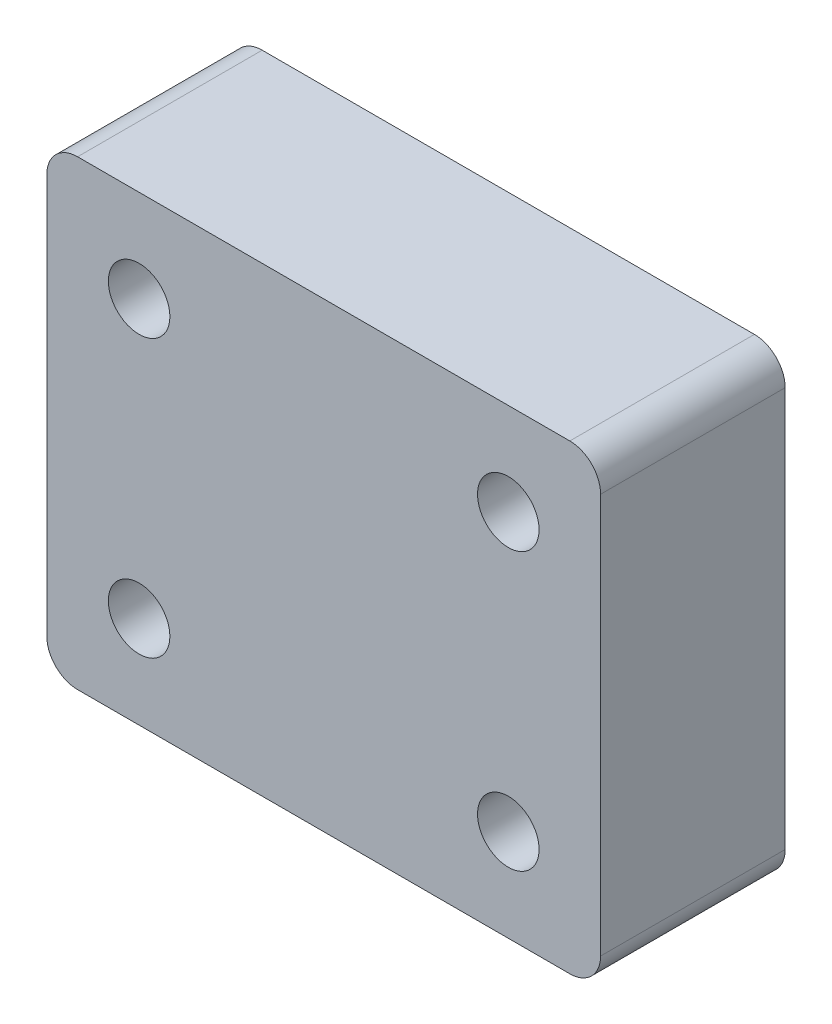
ISO-10303-21;
HEADER;
FILE_DESCRIPTION(('STEP AP214'),'2;1');
FILE_NAME('part.step','',(''),(''),'','','');
FILE_SCHEMA(('AUTOMOTIVE_DESIGN { 1 0 10303 214 1 1 1 1 }'));
ENDSEC;
DATA;
#1=APPLICATION_CONTEXT('core data for automotive mechanical design processes');
#2=APPLICATION_PROTOCOL_DEFINITION('international standard','automotive_design',2000,#1);
#3=PRODUCT_CONTEXT('',#1,'mechanical');
#4=PRODUCT('Part','Part','',(#3));
#5=PRODUCT_RELATED_PRODUCT_CATEGORY('part','',(#4));
#6=PRODUCT_DEFINITION_FORMATION('','',#4);
#7=PRODUCT_DEFINITION_CONTEXT('part definition',#1,'design');
#8=PRODUCT_DEFINITION('design','',#6,#7);
#9=PRODUCT_DEFINITION_SHAPE('','',#8);
#10=(LENGTH_UNIT() NAMED_UNIT(*) SI_UNIT(.MILLI.,.METRE.));
#11=(NAMED_UNIT(*) PLANE_ANGLE_UNIT() SI_UNIT($,.RADIAN.));
#12=(NAMED_UNIT(*) SI_UNIT($,.STERADIAN.) SOLID_ANGLE_UNIT());
#13=UNCERTAINTY_MEASURE_WITH_UNIT(LENGTH_MEASURE(1.E-05),#10,'distance_accuracy_value','');
#14=(GEOMETRIC_REPRESENTATION_CONTEXT(3) GLOBAL_UNCERTAINTY_ASSIGNED_CONTEXT((#13)) GLOBAL_UNIT_ASSIGNED_CONTEXT((#10,
#11,#12)) REPRESENTATION_CONTEXT('',''));
#15=CARTESIAN_POINT('',(0.,0.,0.));
#16=DIRECTION('',(0.,0.,1.));
#17=DIRECTION('',(1.,0.,0.));
#18=AXIS2_PLACEMENT_3D('',#15,#16,#17);
#19=CARTESIAN_POINT('',(-1.,0.,12.));
#20=DIRECTION('',(1.,0.,0.));
#21=DIRECTION('',(0.,0.,-1.));
#22=AXIS2_PLACEMENT_3D('',#19,#20,#21);
#23=PLANE('',#22);
#24=DIRECTION('',(0.,-1.,0.));
#25=VECTOR('',#24,1.);
#26=CARTESIAN_POINT('',(-1.,0.,0.));
#27=LINE('',#26,#25);
#28=CARTESIAN_POINT('',(-1.,28.,0.));
#29=VERTEX_POINT('',#28);
#30=CARTESIAN_POINT('',(-1.,2.,0.));
#31=VERTEX_POINT('',#30);
#32=EDGE_CURVE('E138',#29,#31,#27,.T.);
#33=ORIENTED_EDGE('',*,*,#32,.T.);
#34=DIRECTION('',(0.,0.,-1.));
#35=VECTOR('',#34,1.);
#36=CARTESIAN_POINT('',(-1.,2.,12.));
#37=LINE('',#36,#35);
#38=CARTESIAN_POINT('',(-1.,2.,12.));
#39=VERTEX_POINT('',#38);
#40=EDGE_CURVE('E112',#31,#39,#37,.F.);
#41=ORIENTED_EDGE('',*,*,#40,.T.);
#42=DIRECTION('',(0.,-1.,0.));
#43=VECTOR('',#42,1.);
#44=CARTESIAN_POINT('',(-1.,0.,12.));
#45=LINE('',#44,#43);
#46=CARTESIAN_POINT('',(-1.,28.,12.));
#47=VERTEX_POINT('',#46);
#48=EDGE_CURVE('E151',#47,#39,#45,.T.);
#49=ORIENTED_EDGE('',*,*,#48,.F.);
#50=DIRECTION('',(0.,0.,-1.));
#51=VECTOR('',#50,1.);
#52=CARTESIAN_POINT('',(-1.,28.,12.));
#53=LINE('',#52,#51);
#54=EDGE_CURVE('E118',#47,#29,#53,.T.);
#55=ORIENTED_EDGE('',*,*,#54,.T.);
#56=EDGE_LOOP('',(#33,#41,#49,#55));
#57=FACE_BOUND('',#56,.T.);
#58=ADVANCED_FACE('F39',(#57),#23,.F.);
#59=CARTESIAN_POINT('',(-1.,0.,12.));
#60=DIRECTION('',(0.,1.,0.));
#61=DIRECTION('',(0.,0.,1.));
#62=AXIS2_PLACEMENT_3D('',#59,#60,#61);
#63=PLANE('',#62);
#64=DIRECTION('',(1.,0.,0.));
#65=VECTOR('',#64,1.);
#66=CARTESIAN_POINT('',(-1.,0.,12.));
#67=LINE('',#66,#65);
#68=CARTESIAN_POINT('',(1.,0.,12.));
#69=VERTEX_POINT('',#68);
#70=CARTESIAN_POINT('',(33.,0.,12.));
#71=VERTEX_POINT('',#70);
#72=EDGE_CURVE('E128',#69,#71,#67,.T.);
#73=ORIENTED_EDGE('',*,*,#72,.F.);
#74=DIRECTION('',(0.,0.,-1.));
#75=VECTOR('',#74,1.);
#76=CARTESIAN_POINT('',(1.,0.,12.));
#77=LINE('',#76,#75);
#78=CARTESIAN_POINT('',(1.,0.,0.));
#79=VERTEX_POINT('',#78);
#80=EDGE_CURVE('E111',#69,#79,#77,.T.);
#81=ORIENTED_EDGE('',*,*,#80,.T.);
#82=DIRECTION('',(1.,0.,0.));
#83=VECTOR('',#82,1.);
#84=CARTESIAN_POINT('',(-1.,0.,0.));
#85=LINE('',#84,#83);
#86=CARTESIAN_POINT('',(33.,0.,0.));
#87=VERTEX_POINT('',#86);
#88=EDGE_CURVE('E125',#79,#87,#85,.T.);
#89=ORIENTED_EDGE('',*,*,#88,.T.);
#90=DIRECTION('',(0.,0.,-1.));
#91=VECTOR('',#90,1.);
#92=CARTESIAN_POINT('',(33.,0.,12.));
#93=LINE('',#92,#91);
#94=EDGE_CURVE('E131',#87,#71,#93,.F.);
#95=ORIENTED_EDGE('',*,*,#94,.T.);
#96=EDGE_LOOP('',(#73,#81,#89,#95));
#97=FACE_BOUND('',#96,.T.);
#98=ADVANCED_FACE('F124',(#97),#63,.F.);
#99=CARTESIAN_POINT('',(35.,0.,12.));
#100=DIRECTION('',(-1.,0.,0.));
#101=DIRECTION('',(0.,0.,1.));
#102=AXIS2_PLACEMENT_3D('',#99,#100,#101);
#103=PLANE('',#102);
#104=DIRECTION('',(0.,1.,0.));
#105=VECTOR('',#104,1.);
#106=CARTESIAN_POINT('',(35.,0.,12.));
#107=LINE('',#106,#105);
#108=CARTESIAN_POINT('',(35.,2.,12.));
#109=VERTEX_POINT('',#108);
#110=CARTESIAN_POINT('',(35.,28.,12.));
#111=VERTEX_POINT('',#110);
#112=EDGE_CURVE('E187',#109,#111,#107,.T.);
#113=ORIENTED_EDGE('',*,*,#112,.F.);
#114=DIRECTION('',(0.,0.,-1.));
#115=VECTOR('',#114,1.);
#116=CARTESIAN_POINT('',(35.,2.,12.));
#117=LINE('',#116,#115);
#118=CARTESIAN_POINT('',(35.,2.,0.));
#119=VERTEX_POINT('',#118);
#120=EDGE_CURVE('E11',#109,#119,#117,.T.);
#121=ORIENTED_EDGE('',*,*,#120,.T.);
#122=DIRECTION('',(0.,1.,0.));
#123=VECTOR('',#122,1.);
#124=CARTESIAN_POINT('',(35.,0.,0.));
#125=LINE('',#124,#123);
#126=CARTESIAN_POINT('',(35.,28.,0.));
#127=VERTEX_POINT('',#126);
#128=EDGE_CURVE('E137',#119,#127,#125,.T.);
#129=ORIENTED_EDGE('',*,*,#128,.T.);
#130=DIRECTION('',(0.,0.,-1.));
#131=VECTOR('',#130,1.);
#132=CARTESIAN_POINT('',(35.,28.,12.));
#133=LINE('',#132,#131);
#134=EDGE_CURVE('E48',#127,#111,#133,.F.);
#135=ORIENTED_EDGE('',*,*,#134,.T.);
#136=EDGE_LOOP('',(#113,#121,#129,#135));
#137=FACE_BOUND('',#136,.T.);
#138=ADVANCED_FACE('F186',(#137),#103,.F.);
#139=CARTESIAN_POINT('',(-1.,30.,12.));
#140=DIRECTION('',(0.,-1.,0.));
#141=DIRECTION('',(0.,0.,-1.));
#142=AXIS2_PLACEMENT_3D('',#139,#140,#141);
#143=PLANE('',#142);
#144=DIRECTION('',(-1.,0.,0.));
#145=VECTOR('',#144,1.);
#146=CARTESIAN_POINT('',(-1.,30.,0.));
#147=LINE('',#146,#145);
#148=CARTESIAN_POINT('',(33.,30.,0.));
#149=VERTEX_POINT('',#148);
#150=CARTESIAN_POINT('',(1.,30.,0.));
#151=VERTEX_POINT('',#150);
#152=EDGE_CURVE('E143',#149,#151,#147,.T.);
#153=ORIENTED_EDGE('',*,*,#152,.T.);
#154=DIRECTION('',(0.,0.,-1.));
#155=VECTOR('',#154,1.);
#156=CARTESIAN_POINT('',(1.,30.,12.));
#157=LINE('',#156,#155);
#158=CARTESIAN_POINT('',(1.,30.,12.));
#159=VERTEX_POINT('',#158);
#160=EDGE_CURVE('E55',#151,#159,#157,.F.);
#161=ORIENTED_EDGE('',*,*,#160,.T.);
#162=DIRECTION('',(-1.,0.,0.));
#163=VECTOR('',#162,1.);
#164=CARTESIAN_POINT('',(-1.,30.,12.));
#165=LINE('',#164,#163);
#166=CARTESIAN_POINT('',(33.,30.,12.));
#167=VERTEX_POINT('',#166);
#168=EDGE_CURVE('E153',#167,#159,#165,.T.);
#169=ORIENTED_EDGE('',*,*,#168,.F.);
#170=DIRECTION('',(0.,0.,-1.));
#171=VECTOR('',#170,1.);
#172=CARTESIAN_POINT('',(33.,30.,12.));
#173=LINE('',#172,#171);
#174=EDGE_CURVE('E177',#167,#149,#173,.T.);
#175=ORIENTED_EDGE('',*,*,#174,.T.);
#176=EDGE_LOOP('',(#153,#161,#169,#175));
#177=FACE_BOUND('',#176,.T.);
#178=ADVANCED_FACE('F197',(#177),#143,.F.);
#179=CARTESIAN_POINT('',(0.,0.,12.));
#180=DIRECTION('',(0.,0.,-1.));
#181=DIRECTION('',(-1.,0.,0.));
#182=AXIS2_PLACEMENT_3D('',#179,#180,#181);
#183=PLANE('',#182);
#184=CARTESIAN_POINT('',(5.,24.,12.));
#185=DIRECTION('',(0.,0.,1.));
#186=DIRECTION('',(1.,0.,0.));
#187=AXIS2_PLACEMENT_3D('',#184,#185,#186);
#188=CIRCLE('',#187,2.);
#189=CARTESIAN_POINT('',(7.,24.,12.));
#190=VERTEX_POINT('',#189);
#191=EDGE_CURVE('E218',#190,#190,#188,.T.);
#192=ORIENTED_EDGE('',*,*,#191,.F.);
#193=EDGE_LOOP('',(#192));
#194=FACE_BOUND('',#193,.T.);
#195=CARTESIAN_POINT('',(29.,24.,12.));
#196=DIRECTION('',(0.,0.,1.));
#197=DIRECTION('',(1.,0.,0.));
#198=AXIS2_PLACEMENT_3D('',#195,#196,#197);
#199=CIRCLE('',#198,2.00000000000001);
#200=CARTESIAN_POINT('',(31.,24.,12.));
#201=VERTEX_POINT('',#200);
#202=EDGE_CURVE('E226',#201,#201,#199,.T.);
#203=ORIENTED_EDGE('',*,*,#202,.F.);
#204=EDGE_LOOP('',(#203));
#205=FACE_BOUND('',#204,.T.);
#206=CARTESIAN_POINT('',(29.,6.,12.));
#207=DIRECTION('',(0.,0.,1.));
#208=DIRECTION('',(1.,0.,0.));
#209=AXIS2_PLACEMENT_3D('',#206,#207,#208);
#210=CIRCLE('',#209,2.);
#211=CARTESIAN_POINT('',(31.,6.,12.));
#212=VERTEX_POINT('',#211);
#213=EDGE_CURVE('E234',#212,#212,#210,.T.);
#214=ORIENTED_EDGE('',*,*,#213,.F.);
#215=EDGE_LOOP('',(#214));
#216=FACE_BOUND('',#215,.T.);
#217=CARTESIAN_POINT('',(5.,6.,12.));
#218=DIRECTION('',(0.,0.,1.));
#219=DIRECTION('',(1.,0.,0.));
#220=AXIS2_PLACEMENT_3D('',#217,#218,#219);
#221=CIRCLE('',#220,2.);
#222=CARTESIAN_POINT('',(7.,6.,12.));
#223=VERTEX_POINT('',#222);
#224=EDGE_CURVE('E209',#223,#223,#221,.T.);
#225=ORIENTED_EDGE('',*,*,#224,.F.);
#226=EDGE_LOOP('',(#225));
#227=FACE_BOUND('',#226,.T.);
#228=ORIENTED_EDGE('',*,*,#48,.T.);
#229=CARTESIAN_POINT('',(1.,2.,12.));
#230=DIRECTION('',(0.,0.,-1.));
#231=DIRECTION('',(-1.,0.,0.));
#232=AXIS2_PLACEMENT_3D('',#229,#230,#231);
#233=CIRCLE('',#232,2.);
#234=EDGE_CURVE('E174',#39,#69,#233,.F.);
#235=ORIENTED_EDGE('',*,*,#234,.T.);
#236=ORIENTED_EDGE('',*,*,#72,.T.);
#237=CARTESIAN_POINT('',(33.,2.,12.));
#238=DIRECTION('',(0.,0.,-1.));
#239=DIRECTION('',(-1.,0.,0.));
#240=AXIS2_PLACEMENT_3D('',#237,#238,#239);
#241=CIRCLE('',#240,2.);
#242=EDGE_CURVE('E168',#71,#109,#241,.F.);
#243=ORIENTED_EDGE('',*,*,#242,.T.);
#244=ORIENTED_EDGE('',*,*,#112,.T.);
#245=CARTESIAN_POINT('',(33.,28.,12.));
#246=DIRECTION('',(0.,0.,-1.));
#247=DIRECTION('',(-1.,0.,0.));
#248=AXIS2_PLACEMENT_3D('',#245,#246,#247);
#249=CIRCLE('',#248,2.);
#250=EDGE_CURVE('E62',#111,#167,#249,.F.);
#251=ORIENTED_EDGE('',*,*,#250,.T.);
#252=ORIENTED_EDGE('',*,*,#168,.T.);
#253=CARTESIAN_POINT('',(1.,28.,12.));
#254=DIRECTION('',(0.,0.,-1.));
#255=DIRECTION('',(-1.,0.,0.));
#256=AXIS2_PLACEMENT_3D('',#253,#254,#255);
#257=CIRCLE('',#256,2.);
#258=EDGE_CURVE('E171',#159,#47,#257,.F.);
#259=ORIENTED_EDGE('',*,*,#258,.T.);
#260=EDGE_LOOP('',(#228,#235,#236,#243,#244,#251,#252,#259));
#261=FACE_BOUND('',#260,.T.);
#262=ADVANCED_FACE('F191',(#194,#205,#216,#227,#261),#183,.F.);
#263=CARTESIAN_POINT('',(0.,0.,0.));
#264=DIRECTION('',(0.,0.,-1.));
#265=DIRECTION('',(-1.,0.,0.));
#266=AXIS2_PLACEMENT_3D('',#263,#264,#265);
#267=PLANE('',#266);
#268=CARTESIAN_POINT('',(5.,24.,0.));
#269=DIRECTION('',(0.,0.,1.));
#270=DIRECTION('',(1.,0.,0.));
#271=AXIS2_PLACEMENT_3D('',#268,#269,#270);
#272=CIRCLE('',#271,2.);
#273=CARTESIAN_POINT('',(7.,24.,0.));
#274=VERTEX_POINT('',#273);
#275=EDGE_CURVE('E222',#274,#274,#272,.T.);
#276=ORIENTED_EDGE('',*,*,#275,.T.);
#277=EDGE_LOOP('',(#276));
#278=FACE_BOUND('',#277,.T.);
#279=CARTESIAN_POINT('',(29.,24.,0.));
#280=DIRECTION('',(0.,0.,1.));
#281=DIRECTION('',(1.,0.,0.));
#282=AXIS2_PLACEMENT_3D('',#279,#280,#281);
#283=CIRCLE('',#282,2.00000000000001);
#284=CARTESIAN_POINT('',(31.,24.,0.));
#285=VERTEX_POINT('',#284);
#286=EDGE_CURVE('E230',#285,#285,#283,.T.);
#287=ORIENTED_EDGE('',*,*,#286,.T.);
#288=EDGE_LOOP('',(#287));
#289=FACE_BOUND('',#288,.T.);
#290=CARTESIAN_POINT('',(29.,6.,0.));
#291=DIRECTION('',(0.,0.,1.));
#292=DIRECTION('',(1.,0.,0.));
#293=AXIS2_PLACEMENT_3D('',#290,#291,#292);
#294=CIRCLE('',#293,2.);
#295=CARTESIAN_POINT('',(31.,6.,0.));
#296=VERTEX_POINT('',#295);
#297=EDGE_CURVE('E214',#296,#296,#294,.T.);
#298=ORIENTED_EDGE('',*,*,#297,.T.);
#299=EDGE_LOOP('',(#298));
#300=FACE_BOUND('',#299,.T.);
#301=CARTESIAN_POINT('',(5.,6.,0.));
#302=DIRECTION('',(0.,0.,1.));
#303=DIRECTION('',(1.,0.,0.));
#304=AXIS2_PLACEMENT_3D('',#301,#302,#303);
#305=CIRCLE('',#304,2.);
#306=CARTESIAN_POINT('',(7.,6.,0.));
#307=VERTEX_POINT('',#306);
#308=EDGE_CURVE('E145',#307,#307,#305,.T.);
#309=ORIENTED_EDGE('',*,*,#308,.T.);
#310=EDGE_LOOP('',(#309));
#311=FACE_BOUND('',#310,.T.);
#312=ORIENTED_EDGE('',*,*,#88,.F.);
#313=CARTESIAN_POINT('',(1.,2.,0.));
#314=DIRECTION('',(0.,0.,-1.));
#315=DIRECTION('',(-1.,0.,0.));
#316=AXIS2_PLACEMENT_3D('',#313,#314,#315);
#317=CIRCLE('',#316,2.);
#318=EDGE_CURVE('E107',#79,#31,#317,.T.);
#319=ORIENTED_EDGE('',*,*,#318,.T.);
#320=ORIENTED_EDGE('',*,*,#32,.F.);
#321=CARTESIAN_POINT('',(1.,28.,0.));
#322=DIRECTION('',(0.,0.,-1.));
#323=DIRECTION('',(-1.,0.,0.));
#324=AXIS2_PLACEMENT_3D('',#321,#322,#323);
#325=CIRCLE('',#324,2.);
#326=EDGE_CURVE('E119',#29,#151,#325,.T.);
#327=ORIENTED_EDGE('',*,*,#326,.T.);
#328=ORIENTED_EDGE('',*,*,#152,.F.);
#329=CARTESIAN_POINT('',(33.,28.,0.));
#330=DIRECTION('',(0.,0.,-1.));
#331=DIRECTION('',(-1.,0.,0.));
#332=AXIS2_PLACEMENT_3D('',#329,#330,#331);
#333=CIRCLE('',#332,2.);
#334=EDGE_CURVE('E130',#149,#127,#333,.T.);
#335=ORIENTED_EDGE('',*,*,#334,.T.);
#336=ORIENTED_EDGE('',*,*,#128,.F.);
#337=CARTESIAN_POINT('',(33.,2.,0.));
#338=DIRECTION('',(0.,0.,-1.));
#339=DIRECTION('',(-1.,0.,0.));
#340=AXIS2_PLACEMENT_3D('',#337,#338,#339);
#341=CIRCLE('',#340,2.);
#342=EDGE_CURVE('E135',#119,#87,#341,.T.);
#343=ORIENTED_EDGE('',*,*,#342,.T.);
#344=EDGE_LOOP('',(#312,#319,#320,#327,#328,#335,#336,#343));
#345=FACE_BOUND('',#344,.T.);
#346=ADVANCED_FACE('F133',(#278,#289,#300,#311,#345),#267,.T.);
#347=CARTESIAN_POINT('',(5.,6.,0.));
#348=DIRECTION('',(0.,0.,1.));
#349=DIRECTION('',(1.,0.,0.));
#350=AXIS2_PLACEMENT_3D('',#347,#348,#349);
#351=CYLINDRICAL_SURFACE('',#350,2.);
#352=ORIENTED_EDGE('',*,*,#308,.F.);
#353=EDGE_LOOP('',(#352));
#354=FACE_BOUND('',#353,.T.);
#355=ORIENTED_EDGE('',*,*,#224,.T.);
#356=EDGE_LOOP('',(#355));
#357=FACE_BOUND('',#356,.T.);
#358=ADVANCED_FACE('F248',(#354,#357),#351,.F.);
#359=CARTESIAN_POINT('',(29.,6.,0.));
#360=DIRECTION('',(0.,0.,1.));
#361=DIRECTION('',(1.,0.,0.));
#362=AXIS2_PLACEMENT_3D('',#359,#360,#361);
#363=CYLINDRICAL_SURFACE('',#362,2.);
#364=ORIENTED_EDGE('',*,*,#297,.F.);
#365=EDGE_LOOP('',(#364));
#366=FACE_BOUND('',#365,.T.);
#367=ORIENTED_EDGE('',*,*,#213,.T.);
#368=EDGE_LOOP('',(#367));
#369=FACE_BOUND('',#368,.T.);
#370=ADVANCED_FACE('F244',(#366,#369),#363,.F.);
#371=CARTESIAN_POINT('',(29.,24.,0.));
#372=DIRECTION('',(0.,0.,1.));
#373=DIRECTION('',(1.,0.,0.));
#374=AXIS2_PLACEMENT_3D('',#371,#372,#373);
#375=CYLINDRICAL_SURFACE('',#374,2.00000000000001);
#376=ORIENTED_EDGE('',*,*,#286,.F.);
#377=EDGE_LOOP('',(#376));
#378=FACE_BOUND('',#377,.T.);
#379=ORIENTED_EDGE('',*,*,#202,.T.);
#380=EDGE_LOOP('',(#379));
#381=FACE_BOUND('',#380,.T.);
#382=ADVANCED_FACE('F247',(#378,#381),#375,.F.);
#383=CARTESIAN_POINT('',(5.,24.,0.));
#384=DIRECTION('',(0.,0.,1.));
#385=DIRECTION('',(1.,0.,0.));
#386=AXIS2_PLACEMENT_3D('',#383,#384,#385);
#387=CYLINDRICAL_SURFACE('',#386,2.);
#388=ORIENTED_EDGE('',*,*,#275,.F.);
#389=EDGE_LOOP('',(#388));
#390=FACE_BOUND('',#389,.T.);
#391=ORIENTED_EDGE('',*,*,#191,.T.);
#392=EDGE_LOOP('',(#391));
#393=FACE_BOUND('',#392,.T.);
#394=ADVANCED_FACE('F278',(#390,#393),#387,.F.);
#395=CARTESIAN_POINT('',(1.,2.,12.));
#396=DIRECTION('',(0.,0.,-1.));
#397=DIRECTION('',(-1.,0.,0.));
#398=AXIS2_PLACEMENT_3D('',#395,#396,#397);
#399=CYLINDRICAL_SURFACE('',#398,2.);
#400=ORIENTED_EDGE('',*,*,#234,.F.);
#401=ORIENTED_EDGE('',*,*,#40,.F.);
#402=ORIENTED_EDGE('',*,*,#318,.F.);
#403=ORIENTED_EDGE('',*,*,#80,.F.);
#404=EDGE_LOOP('',(#400,#401,#402,#403));
#405=FACE_BOUND('',#404,.T.);
#406=ADVANCED_FACE('F110',(#405),#399,.T.);
#407=CARTESIAN_POINT('',(1.,28.,12.));
#408=DIRECTION('',(0.,0.,-1.));
#409=DIRECTION('',(-1.,0.,0.));
#410=AXIS2_PLACEMENT_3D('',#407,#408,#409);
#411=CYLINDRICAL_SURFACE('',#410,2.);
#412=ORIENTED_EDGE('',*,*,#258,.F.);
#413=ORIENTED_EDGE('',*,*,#160,.F.);
#414=ORIENTED_EDGE('',*,*,#326,.F.);
#415=ORIENTED_EDGE('',*,*,#54,.F.);
#416=EDGE_LOOP('',(#412,#413,#414,#415));
#417=FACE_BOUND('',#416,.T.);
#418=ADVANCED_FACE('F201',(#417),#411,.T.);
#419=CARTESIAN_POINT('',(33.,2.,12.));
#420=DIRECTION('',(0.,0.,-1.));
#421=DIRECTION('',(-1.,0.,0.));
#422=AXIS2_PLACEMENT_3D('',#419,#420,#421);
#423=CYLINDRICAL_SURFACE('',#422,2.);
#424=ORIENTED_EDGE('',*,*,#242,.F.);
#425=ORIENTED_EDGE('',*,*,#94,.F.);
#426=ORIENTED_EDGE('',*,*,#342,.F.);
#427=ORIENTED_EDGE('',*,*,#120,.F.);
#428=EDGE_LOOP('',(#424,#425,#426,#427));
#429=FACE_BOUND('',#428,.T.);
#430=ADVANCED_FACE('F280',(#429),#423,.T.);
#431=CARTESIAN_POINT('',(33.,28.,12.));
#432=DIRECTION('',(0.,0.,-1.));
#433=DIRECTION('',(-1.,0.,0.));
#434=AXIS2_PLACEMENT_3D('',#431,#432,#433);
#435=CYLINDRICAL_SURFACE('',#434,2.);
#436=ORIENTED_EDGE('',*,*,#250,.F.);
#437=ORIENTED_EDGE('',*,*,#134,.F.);
#438=ORIENTED_EDGE('',*,*,#334,.F.);
#439=ORIENTED_EDGE('',*,*,#174,.F.);
#440=EDGE_LOOP('',(#436,#437,#438,#439));
#441=FACE_BOUND('',#440,.T.);
#442=ADVANCED_FACE('F41',(#441),#435,.T.);
#443=CLOSED_SHELL('',(#58,#98,#138,#178,#262,#346,#358,#370,#382,#394,#406,#418,#430,#442));
#444=MANIFOLD_SOLID_BREP('B2',#443);
#445=ADVANCED_BREP_SHAPE_REPRESENTATION('',(#18,#444),#14);
#446=SHAPE_DEFINITION_REPRESENTATION(#9,#445);
ENDSEC;
END-ISO-10303-21;
